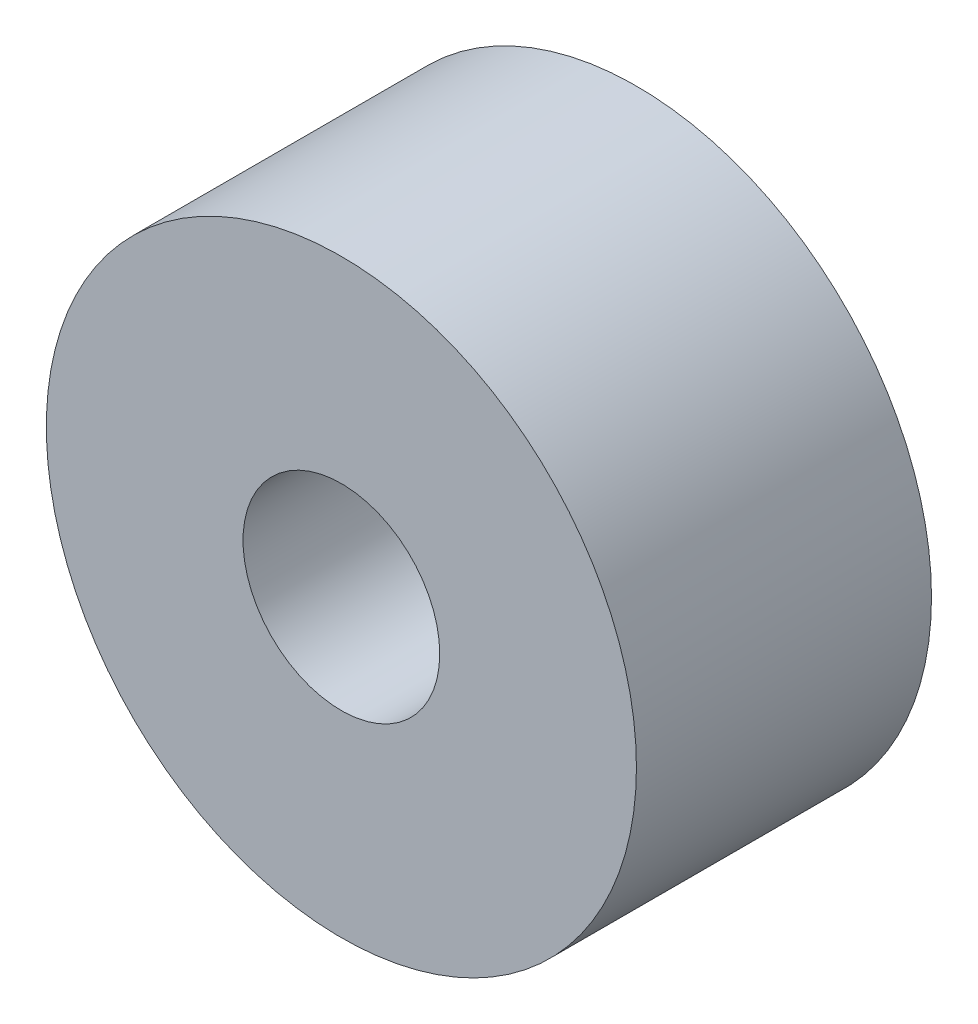
ISO-10303-21;
HEADER;
FILE_DESCRIPTION(('STEP AP214'),'2;1');
FILE_NAME('part.step','',(''),(''),'','','');
FILE_SCHEMA(('AUTOMOTIVE_DESIGN { 1 0 10303 214 1 1 1 1 }'));
ENDSEC;
DATA;
#1=APPLICATION_CONTEXT('core data for automotive mechanical design processes');
#2=APPLICATION_PROTOCOL_DEFINITION('international standard','automotive_design',2000,#1);
#3=PRODUCT_CONTEXT('',#1,'mechanical');
#4=PRODUCT('Part','Part','',(#3));
#5=PRODUCT_RELATED_PRODUCT_CATEGORY('part','',(#4));
#6=PRODUCT_DEFINITION_FORMATION('','',#4);
#7=PRODUCT_DEFINITION_CONTEXT('part definition',#1,'design');
#8=PRODUCT_DEFINITION('design','',#6,#7);
#9=PRODUCT_DEFINITION_SHAPE('','',#8);
#10=(LENGTH_UNIT() NAMED_UNIT(*) SI_UNIT(.MILLI.,.METRE.));
#11=(NAMED_UNIT(*) PLANE_ANGLE_UNIT() SI_UNIT($,.RADIAN.));
#12=(NAMED_UNIT(*) SI_UNIT($,.STERADIAN.) SOLID_ANGLE_UNIT());
#13=UNCERTAINTY_MEASURE_WITH_UNIT(LENGTH_MEASURE(1.E-05),#10,'distance_accuracy_value','');
#14=(GEOMETRIC_REPRESENTATION_CONTEXT(3) GLOBAL_UNCERTAINTY_ASSIGNED_CONTEXT((#13)) GLOBAL_UNIT_ASSIGNED_CONTEXT((#10,
#11,#12)) REPRESENTATION_CONTEXT('',''));
#15=CARTESIAN_POINT('',(0.,0.,0.));
#16=DIRECTION('',(0.,0.,1.));
#17=DIRECTION('',(1.,0.,0.));
#18=AXIS2_PLACEMENT_3D('',#15,#16,#17);
#19=CARTESIAN_POINT('',(0.,0.,15.));
#20=DIRECTION('',(0.,0.,-1.));
#21=DIRECTION('',(-1.,0.,0.));
#22=AXIS2_PLACEMENT_3D('',#19,#20,#21);
#23=CYLINDRICAL_SURFACE('',#22,5.);
#24=CARTESIAN_POINT('',(0.,0.,15.));
#25=DIRECTION('',(0.,0.,-1.));
#26=DIRECTION('',(1.,0.,0.));
#27=AXIS2_PLACEMENT_3D('',#24,#25,#26);
#28=CIRCLE('',#27,5.);
#29=CARTESIAN_POINT('',(5.,0.,15.));
#30=VERTEX_POINT('',#29);
#31=EDGE_CURVE('E9',#30,#30,#28,.T.);
#32=ORIENTED_EDGE('',*,*,#31,.F.);
#33=EDGE_LOOP('',(#32));
#34=FACE_BOUND('',#33,.T.);
#35=CARTESIAN_POINT('',(0.,0.,0.));
#36=DIRECTION('',(0.,0.,-1.));
#37=DIRECTION('',(1.,0.,0.));
#38=AXIS2_PLACEMENT_3D('',#35,#36,#37);
#39=CIRCLE('',#38,5.);
#40=CARTESIAN_POINT('',(5.,0.,0.));
#41=VERTEX_POINT('',#40);
#42=EDGE_CURVE('E24',#41,#41,#39,.T.);
#43=ORIENTED_EDGE('',*,*,#42,.T.);
#44=EDGE_LOOP('',(#43));
#45=FACE_BOUND('',#44,.T.);
#46=ADVANCED_FACE('F13',(#34,#45),#23,.F.);
#47=CARTESIAN_POINT('',(0.,0.,15.));
#48=DIRECTION('',(0.,0.,-1.));
#49=DIRECTION('',(-1.,0.,0.));
#50=AXIS2_PLACEMENT_3D('',#47,#48,#49);
#51=CYLINDRICAL_SURFACE('',#50,15.);
#52=CARTESIAN_POINT('',(0.,0.,15.));
#53=DIRECTION('',(0.,0.,-1.));
#54=DIRECTION('',(1.,0.,0.));
#55=AXIS2_PLACEMENT_3D('',#52,#53,#54);
#56=CIRCLE('',#55,15.);
#57=CARTESIAN_POINT('',(15.,0.,15.));
#58=VERTEX_POINT('',#57);
#59=EDGE_CURVE('E20',#58,#58,#56,.T.);
#60=ORIENTED_EDGE('',*,*,#59,.T.);
#61=EDGE_LOOP('',(#60));
#62=FACE_BOUND('',#61,.T.);
#63=CARTESIAN_POINT('',(0.,0.,0.));
#64=DIRECTION('',(0.,0.,-1.));
#65=DIRECTION('',(1.,0.,0.));
#66=AXIS2_PLACEMENT_3D('',#63,#64,#65);
#67=CIRCLE('',#66,15.);
#68=CARTESIAN_POINT('',(15.,0.,0.));
#69=VERTEX_POINT('',#68);
#70=EDGE_CURVE('E29',#69,#69,#67,.T.);
#71=ORIENTED_EDGE('',*,*,#70,.F.);
#72=EDGE_LOOP('',(#71));
#73=FACE_BOUND('',#72,.T.);
#74=ADVANCED_FACE('F15',(#62,#73),#51,.T.);
#75=CARTESIAN_POINT('',(0.,0.,15.));
#76=DIRECTION('',(0.,0.,-1.));
#77=DIRECTION('',(-1.,0.,0.));
#78=AXIS2_PLACEMENT_3D('',#75,#76,#77);
#79=PLANE('',#78);
#80=ORIENTED_EDGE('',*,*,#31,.T.);
#81=EDGE_LOOP('',(#80));
#82=FACE_BOUND('',#81,.T.);
#83=ORIENTED_EDGE('',*,*,#59,.F.);
#84=EDGE_LOOP('',(#83));
#85=FACE_BOUND('',#84,.T.);
#86=ADVANCED_FACE('F41',(#82,#85),#79,.F.);
#87=CARTESIAN_POINT('',(0.,0.,0.));
#88=DIRECTION('',(0.,0.,-1.));
#89=DIRECTION('',(-1.,0.,0.));
#90=AXIS2_PLACEMENT_3D('',#87,#88,#89);
#91=PLANE('',#90);
#92=ORIENTED_EDGE('',*,*,#42,.F.);
#93=EDGE_LOOP('',(#92));
#94=FACE_BOUND('',#93,.T.);
#95=ORIENTED_EDGE('',*,*,#70,.T.);
#96=EDGE_LOOP('',(#95));
#97=FACE_BOUND('',#96,.T.);
#98=ADVANCED_FACE('F38',(#94,#97),#91,.T.);
#99=CLOSED_SHELL('',(#46,#74,#86,#98));
#100=MANIFOLD_SOLID_BREP('B1',#99);
#101=ADVANCED_BREP_SHAPE_REPRESENTATION('',(#18,#100),#14);
#102=SHAPE_DEFINITION_REPRESENTATION(#9,#101);
ENDSEC;
END-ISO-10303-21;
